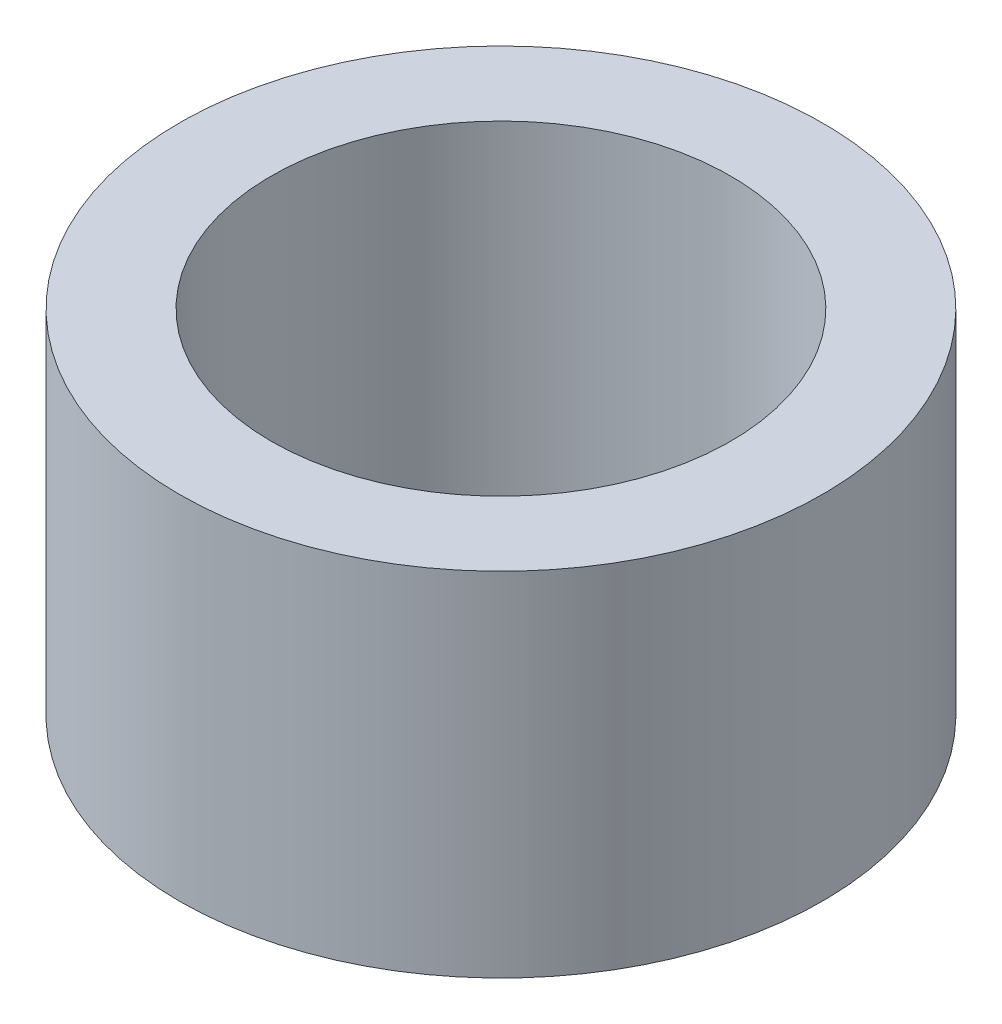
ISO-10303-21;
HEADER;
FILE_DESCRIPTION(('STEP AP214'),'2;1');
FILE_NAME('part.step','',(''),(''),'','','');
FILE_SCHEMA(('AUTOMOTIVE_DESIGN { 1 0 10303 214 1 1 1 1 }'));
ENDSEC;
DATA;
#1=APPLICATION_CONTEXT('core data for automotive mechanical design processes');
#2=APPLICATION_PROTOCOL_DEFINITION('international standard','automotive_design',2000,#1);
#3=PRODUCT_CONTEXT('',#1,'mechanical');
#4=PRODUCT('Part','Part','',(#3));
#5=PRODUCT_RELATED_PRODUCT_CATEGORY('part','',(#4));
#6=PRODUCT_DEFINITION_FORMATION('','',#4);
#7=PRODUCT_DEFINITION_CONTEXT('part definition',#1,'design');
#8=PRODUCT_DEFINITION('design','',#6,#7);
#9=PRODUCT_DEFINITION_SHAPE('','',#8);
#10=(LENGTH_UNIT() NAMED_UNIT(*) SI_UNIT(.MILLI.,.METRE.));
#11=(NAMED_UNIT(*) PLANE_ANGLE_UNIT() SI_UNIT($,.RADIAN.));
#12=(NAMED_UNIT(*) SI_UNIT($,.STERADIAN.) SOLID_ANGLE_UNIT());
#13=UNCERTAINTY_MEASURE_WITH_UNIT(LENGTH_MEASURE(1.E-05),#10,'distance_accuracy_value','');
#14=(GEOMETRIC_REPRESENTATION_CONTEXT(3) GLOBAL_UNCERTAINTY_ASSIGNED_CONTEXT((#13)) GLOBAL_UNIT_ASSIGNED_CONTEXT((#10,
#11,#12)) REPRESENTATION_CONTEXT('',''));
#15=CARTESIAN_POINT('',(0.,0.,0.));
#16=DIRECTION('',(0.,0.,1.));
#17=DIRECTION('',(1.,0.,0.));
#18=AXIS2_PLACEMENT_3D('',#15,#16,#17);
#19=CARTESIAN_POINT('',(0.,4.6,0.));
#20=DIRECTION('',(0.,1.,0.));
#21=DIRECTION('',(0.,0.,1.));
#22=AXIS2_PLACEMENT_3D('',#19,#20,#21);
#23=PLANE('',#22);
#24=CARTESIAN_POINT('',(0.,4.6,0.));
#25=DIRECTION('',(0.,1.,0.));
#26=DIRECTION('',(0.,0.,1.));
#27=AXIS2_PLACEMENT_3D('',#24,#25,#26);
#28=CIRCLE('',#27,4.2);
#29=CARTESIAN_POINT('',(0.,4.6,4.2));
#30=VERTEX_POINT('',#29);
#31=EDGE_CURVE('E10',#30,#30,#28,.T.);
#32=ORIENTED_EDGE('',*,*,#31,.T.);
#33=EDGE_LOOP('',(#32));
#34=FACE_BOUND('',#33,.T.);
#35=CARTESIAN_POINT('',(0.,4.6,0.));
#36=DIRECTION('',(0.,1.,0.));
#37=DIRECTION('',(0.,0.,1.));
#38=AXIS2_PLACEMENT_3D('',#35,#36,#37);
#39=CIRCLE('',#38,3.);
#40=CARTESIAN_POINT('',(0.,4.6,3.));
#41=VERTEX_POINT('',#40);
#42=EDGE_CURVE('E48',#41,#41,#39,.T.);
#43=ORIENTED_EDGE('',*,*,#42,.F.);
#44=EDGE_LOOP('',(#43));
#45=FACE_BOUND('',#44,.T.);
#46=ADVANCED_FACE('F37',(#34,#45),#23,.T.);
#47=CARTESIAN_POINT('',(0.,0.,0.));
#48=DIRECTION('',(0.,1.,0.));
#49=DIRECTION('',(0.,0.,1.));
#50=AXIS2_PLACEMENT_3D('',#47,#48,#49);
#51=PLANE('',#50);
#52=CARTESIAN_POINT('',(0.,0.,0.));
#53=DIRECTION('',(0.,1.,0.));
#54=DIRECTION('',(0.,0.,1.));
#55=AXIS2_PLACEMENT_3D('',#52,#53,#54);
#56=CIRCLE('',#55,4.2);
#57=CARTESIAN_POINT('',(0.,0.,4.2));
#58=VERTEX_POINT('',#57);
#59=EDGE_CURVE('E41',#58,#58,#56,.T.);
#60=ORIENTED_EDGE('',*,*,#59,.F.);
#61=EDGE_LOOP('',(#60));
#62=FACE_BOUND('',#61,.T.);
#63=CARTESIAN_POINT('',(0.,0.,0.));
#64=DIRECTION('',(0.,1.,0.));
#65=DIRECTION('',(0.,0.,1.));
#66=AXIS2_PLACEMENT_3D('',#63,#64,#65);
#67=CIRCLE('',#66,3.);
#68=CARTESIAN_POINT('',(0.,0.,3.));
#69=VERTEX_POINT('',#68);
#70=EDGE_CURVE('E50',#69,#69,#67,.T.);
#71=ORIENTED_EDGE('',*,*,#70,.T.);
#72=EDGE_LOOP('',(#71));
#73=FACE_BOUND('',#72,.T.);
#74=ADVANCED_FACE('F60',(#62,#73),#51,.F.);
#75=CARTESIAN_POINT('',(0.,4.6,0.));
#76=DIRECTION('',(0.,-1.,0.));
#77=DIRECTION('',(0.,0.,-1.));
#78=AXIS2_PLACEMENT_3D('',#75,#76,#77);
#79=CYLINDRICAL_SURFACE('',#78,4.2);
#80=ORIENTED_EDGE('',*,*,#31,.F.);
#81=EDGE_LOOP('',(#80));
#82=FACE_BOUND('',#81,.T.);
#83=ORIENTED_EDGE('',*,*,#59,.T.);
#84=EDGE_LOOP('',(#83));
#85=FACE_BOUND('',#84,.T.);
#86=ADVANCED_FACE('F39',(#82,#85),#79,.T.);
#87=CARTESIAN_POINT('',(0.,4.6,0.));
#88=DIRECTION('',(0.,-1.,0.));
#89=DIRECTION('',(0.,0.,-1.));
#90=AXIS2_PLACEMENT_3D('',#87,#88,#89);
#91=CYLINDRICAL_SURFACE('',#90,3.);
#92=ORIENTED_EDGE('',*,*,#42,.T.);
#93=EDGE_LOOP('',(#92));
#94=FACE_BOUND('',#93,.T.);
#95=ORIENTED_EDGE('',*,*,#70,.F.);
#96=EDGE_LOOP('',(#95));
#97=FACE_BOUND('',#96,.T.);
#98=ADVANCED_FACE('F56',(#94,#97),#91,.F.);
#99=CLOSED_SHELL('',(#46,#74,#86,#98));
#100=MANIFOLD_SOLID_BREP('B2',#99);
#101=ADVANCED_BREP_SHAPE_REPRESENTATION('',(#18,#100),#14);
#102=SHAPE_DEFINITION_REPRESENTATION(#9,#101);
ENDSEC;
END-ISO-10303-21;
